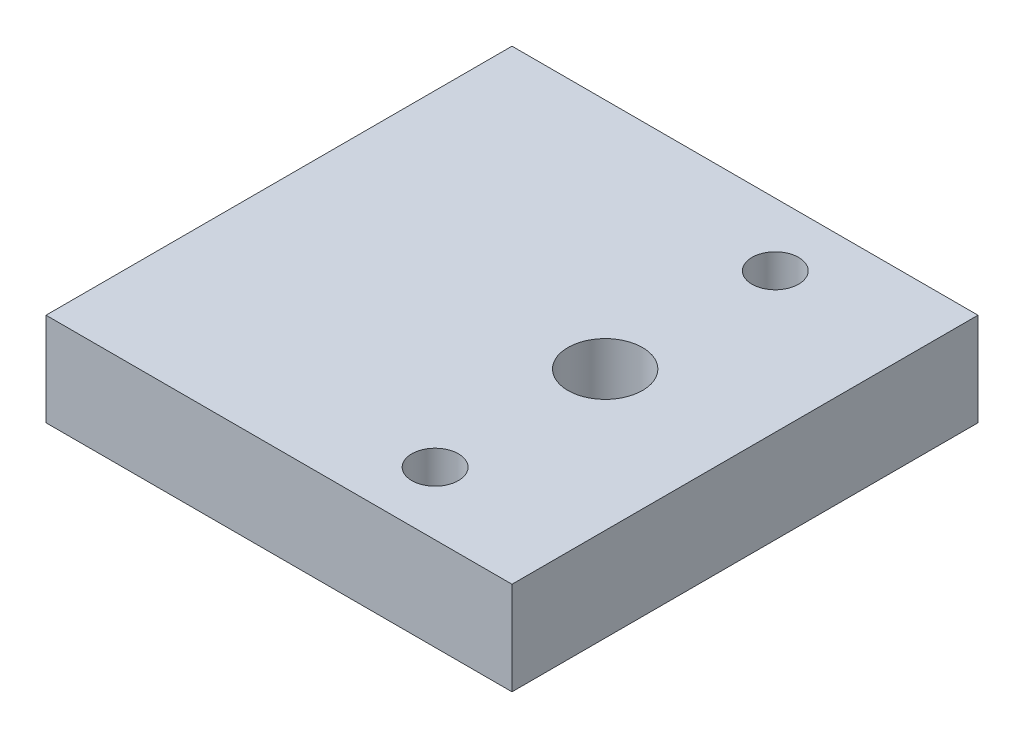
ISO-10303-21;
HEADER;
FILE_DESCRIPTION(('STEP AP214'),'2;1');
FILE_NAME('part.step','',(''),(''),'','','');
FILE_SCHEMA(('AUTOMOTIVE_DESIGN { 1 0 10303 214 1 1 1 1 }'));
ENDSEC;
DATA;
#1=APPLICATION_CONTEXT('core data for automotive mechanical design processes');
#2=APPLICATION_PROTOCOL_DEFINITION('international standard','automotive_design',2000,#1);
#3=PRODUCT_CONTEXT('',#1,'mechanical');
#4=PRODUCT('Part','Part','',(#3));
#5=PRODUCT_RELATED_PRODUCT_CATEGORY('part','',(#4));
#6=PRODUCT_DEFINITION_FORMATION('','',#4);
#7=PRODUCT_DEFINITION_CONTEXT('part definition',#1,'design');
#8=PRODUCT_DEFINITION('design','',#6,#7);
#9=PRODUCT_DEFINITION_SHAPE('','',#8);
#10=(LENGTH_UNIT() NAMED_UNIT(*) SI_UNIT(.MILLI.,.METRE.));
#11=(NAMED_UNIT(*) PLANE_ANGLE_UNIT() SI_UNIT($,.RADIAN.));
#12=(NAMED_UNIT(*) SI_UNIT($,.STERADIAN.) SOLID_ANGLE_UNIT());
#13=UNCERTAINTY_MEASURE_WITH_UNIT(LENGTH_MEASURE(1.E-05),#10,'distance_accuracy_value','');
#14=(GEOMETRIC_REPRESENTATION_CONTEXT(3) GLOBAL_UNCERTAINTY_ASSIGNED_CONTEXT((#13)) GLOBAL_UNIT_ASSIGNED_CONTEXT((#10,
#11,#12)) REPRESENTATION_CONTEXT('',''));
#15=CARTESIAN_POINT('',(0.,0.,0.));
#16=DIRECTION('',(0.,0.,1.));
#17=DIRECTION('',(1.,0.,0.));
#18=AXIS2_PLACEMENT_3D('',#15,#16,#17);
#19=CARTESIAN_POINT('',(25.,10.,25.));
#20=DIRECTION('',(-1.,0.,0.));
#21=DIRECTION('',(0.,0.,1.));
#22=AXIS2_PLACEMENT_3D('',#19,#20,#21);
#23=PLANE('',#22);
#24=DIRECTION('',(0.,0.,-1.));
#25=VECTOR('',#24,1.);
#26=CARTESIAN_POINT('',(25.,0.,25.));
#27=LINE('',#26,#25);
#28=CARTESIAN_POINT('',(25.,0.,25.));
#29=VERTEX_POINT('',#28);
#30=CARTESIAN_POINT('',(25.,0.,-25.));
#31=VERTEX_POINT('',#30);
#32=EDGE_CURVE('E98',#29,#31,#27,.T.);
#33=ORIENTED_EDGE('',*,*,#32,.T.);
#34=DIRECTION('',(0.,-1.,0.));
#35=VECTOR('',#34,1.);
#36=CARTESIAN_POINT('',(25.,10.,-25.));
#37=LINE('',#36,#35);
#38=CARTESIAN_POINT('',(25.,10.,-25.));
#39=VERTEX_POINT('',#38);
#40=EDGE_CURVE('E11',#39,#31,#37,.T.);
#41=ORIENTED_EDGE('',*,*,#40,.F.);
#42=DIRECTION('',(0.,0.,-1.));
#43=VECTOR('',#42,1.);
#44=CARTESIAN_POINT('',(25.,10.,25.));
#45=LINE('',#44,#43);
#46=CARTESIAN_POINT('',(25.,10.,25.));
#47=VERTEX_POINT('',#46);
#48=EDGE_CURVE('E86',#47,#39,#45,.T.);
#49=ORIENTED_EDGE('',*,*,#48,.F.);
#50=DIRECTION('',(0.,-1.,0.));
#51=VECTOR('',#50,1.);
#52=CARTESIAN_POINT('',(25.,10.,25.));
#53=LINE('',#52,#51);
#54=EDGE_CURVE('E94',#47,#29,#53,.T.);
#55=ORIENTED_EDGE('',*,*,#54,.T.);
#56=EDGE_LOOP('',(#33,#41,#49,#55));
#57=FACE_BOUND('',#56,.T.);
#58=ADVANCED_FACE('F35',(#57),#23,.F.);
#59=CARTESIAN_POINT('',(-25.,10.,-25.));
#60=DIRECTION('',(0.,0.,1.));
#61=DIRECTION('',(1.,0.,0.));
#62=AXIS2_PLACEMENT_3D('',#59,#60,#61);
#63=PLANE('',#62);
#64=DIRECTION('',(-1.,0.,0.));
#65=VECTOR('',#64,1.);
#66=CARTESIAN_POINT('',(-25.,0.,-25.));
#67=LINE('',#66,#65);
#68=CARTESIAN_POINT('',(-25.,0.,-25.));
#69=VERTEX_POINT('',#68);
#70=EDGE_CURVE('E90',#31,#69,#67,.T.);
#71=ORIENTED_EDGE('',*,*,#70,.T.);
#72=DIRECTION('',(0.,-1.,0.));
#73=VECTOR('',#72,1.);
#74=CARTESIAN_POINT('',(-25.,10.,-25.));
#75=LINE('',#74,#73);
#76=CARTESIAN_POINT('',(-25.,10.,-25.));
#77=VERTEX_POINT('',#76);
#78=EDGE_CURVE('E43',#77,#69,#75,.T.);
#79=ORIENTED_EDGE('',*,*,#78,.F.);
#80=DIRECTION('',(-1.,0.,0.));
#81=VECTOR('',#80,1.);
#82=CARTESIAN_POINT('',(-25.,10.,-25.));
#83=LINE('',#82,#81);
#84=EDGE_CURVE('E81',#39,#77,#83,.T.);
#85=ORIENTED_EDGE('',*,*,#84,.F.);
#86=ORIENTED_EDGE('',*,*,#40,.T.);
#87=EDGE_LOOP('',(#71,#79,#85,#86));
#88=FACE_BOUND('',#87,.T.);
#89=ADVANCED_FACE('F89',(#88),#63,.F.);
#90=CARTESIAN_POINT('',(-25.,10.,25.));
#91=DIRECTION('',(1.,0.,0.));
#92=DIRECTION('',(0.,0.,-1.));
#93=AXIS2_PLACEMENT_3D('',#90,#91,#92);
#94=PLANE('',#93);
#95=DIRECTION('',(0.,0.,1.));
#96=VECTOR('',#95,1.);
#97=CARTESIAN_POINT('',(-25.,0.,25.));
#98=LINE('',#97,#96);
#99=CARTESIAN_POINT('',(-25.,0.,25.));
#100=VERTEX_POINT('',#99);
#101=EDGE_CURVE('E68',#69,#100,#98,.T.);
#102=ORIENTED_EDGE('',*,*,#101,.T.);
#103=DIRECTION('',(0.,-1.,0.));
#104=VECTOR('',#103,1.);
#105=CARTESIAN_POINT('',(-25.,10.,25.));
#106=LINE('',#105,#104);
#107=CARTESIAN_POINT('',(-25.,10.,25.));
#108=VERTEX_POINT('',#107);
#109=EDGE_CURVE('E91',#108,#100,#106,.T.);
#110=ORIENTED_EDGE('',*,*,#109,.F.);
#111=DIRECTION('',(0.,0.,1.));
#112=VECTOR('',#111,1.);
#113=CARTESIAN_POINT('',(-25.,10.,25.));
#114=LINE('',#113,#112);
#115=EDGE_CURVE('E84',#77,#108,#114,.T.);
#116=ORIENTED_EDGE('',*,*,#115,.F.);
#117=ORIENTED_EDGE('',*,*,#78,.T.);
#118=EDGE_LOOP('',(#102,#110,#116,#117));
#119=FACE_BOUND('',#118,.T.);
#120=ADVANCED_FACE('F92',(#119),#94,.F.);
#121=CARTESIAN_POINT('',(-25.,10.,25.));
#122=DIRECTION('',(0.,0.,-1.));
#123=DIRECTION('',(-1.,0.,0.));
#124=AXIS2_PLACEMENT_3D('',#121,#122,#123);
#125=PLANE('',#124);
#126=DIRECTION('',(1.,0.,0.));
#127=VECTOR('',#126,1.);
#128=CARTESIAN_POINT('',(-25.,0.,25.));
#129=LINE('',#128,#127);
#130=EDGE_CURVE('E74',#100,#29,#129,.T.);
#131=ORIENTED_EDGE('',*,*,#130,.T.);
#132=ORIENTED_EDGE('',*,*,#54,.F.);
#133=DIRECTION('',(1.,0.,0.));
#134=VECTOR('',#133,1.);
#135=CARTESIAN_POINT('',(-25.,10.,25.));
#136=LINE('',#135,#134);
#137=EDGE_CURVE('E51',#108,#47,#136,.T.);
#138=ORIENTED_EDGE('',*,*,#137,.F.);
#139=ORIENTED_EDGE('',*,*,#109,.T.);
#140=EDGE_LOOP('',(#131,#132,#138,#139));
#141=FACE_BOUND('',#140,.T.);
#142=ADVANCED_FACE('F106',(#141),#125,.F.);
#143=CARTESIAN_POINT('',(0.,10.,0.));
#144=DIRECTION('',(0.,-1.,0.));
#145=DIRECTION('',(0.,0.,-1.));
#146=AXIS2_PLACEMENT_3D('',#143,#144,#145);
#147=PLANE('',#146);
#148=CARTESIAN_POINT('',(10.,10.,0.));
#149=DIRECTION('',(0.,1.,0.));
#150=DIRECTION('',(0.,0.,1.));
#151=AXIS2_PLACEMENT_3D('',#148,#149,#150);
#152=CIRCLE('',#151,4.);
#153=CARTESIAN_POINT('',(10.,10.,4.));
#154=VERTEX_POINT('',#153);
#155=EDGE_CURVE('E124',#154,#154,#152,.T.);
#156=ORIENTED_EDGE('',*,*,#155,.F.);
#157=EDGE_LOOP('',(#156));
#158=FACE_BOUND('',#157,.T.);
#159=CARTESIAN_POINT('',(10.,10.,18.25));
#160=DIRECTION('',(0.,1.,0.));
#161=DIRECTION('',(0.,0.,1.));
#162=AXIS2_PLACEMENT_3D('',#159,#160,#161);
#163=CIRCLE('',#162,2.5);
#164=CARTESIAN_POINT('',(10.,10.,20.75));
#165=VERTEX_POINT('',#164);
#166=EDGE_CURVE('E118',#165,#165,#163,.T.);
#167=ORIENTED_EDGE('',*,*,#166,.F.);
#168=EDGE_LOOP('',(#167));
#169=FACE_BOUND('',#168,.T.);
#170=CARTESIAN_POINT('',(10.,10.,-18.25));
#171=DIRECTION('',(0.,1.,0.));
#172=DIRECTION('',(0.,0.,1.));
#173=AXIS2_PLACEMENT_3D('',#170,#171,#172);
#174=CIRCLE('',#173,2.5);
#175=CARTESIAN_POINT('',(10.,10.,-15.75));
#176=VERTEX_POINT('',#175);
#177=EDGE_CURVE('E112',#176,#176,#174,.T.);
#178=ORIENTED_EDGE('',*,*,#177,.F.);
#179=EDGE_LOOP('',(#178));
#180=FACE_BOUND('',#179,.T.);
#181=ORIENTED_EDGE('',*,*,#48,.T.);
#182=ORIENTED_EDGE('',*,*,#84,.T.);
#183=ORIENTED_EDGE('',*,*,#115,.T.);
#184=ORIENTED_EDGE('',*,*,#137,.T.);
#185=EDGE_LOOP('',(#181,#182,#183,#184));
#186=FACE_BOUND('',#185,.T.);
#187=ADVANCED_FACE('F82',(#158,#169,#180,#186),#147,.F.);
#188=CARTESIAN_POINT('',(0.,0.,0.));
#189=DIRECTION('',(0.,-1.,0.));
#190=DIRECTION('',(0.,0.,-1.));
#191=AXIS2_PLACEMENT_3D('',#188,#189,#190);
#192=PLANE('',#191);
#193=CARTESIAN_POINT('',(10.,0.,0.));
#194=DIRECTION('',(0.,1.,0.));
#195=DIRECTION('',(0.,0.,1.));
#196=AXIS2_PLACEMENT_3D('',#193,#194,#195);
#197=CIRCLE('',#196,4.);
#198=CARTESIAN_POINT('',(10.,0.,4.));
#199=VERTEX_POINT('',#198);
#200=EDGE_CURVE('E121',#199,#199,#197,.T.);
#201=ORIENTED_EDGE('',*,*,#200,.T.);
#202=EDGE_LOOP('',(#201));
#203=FACE_BOUND('',#202,.T.);
#204=CARTESIAN_POINT('',(10.,0.,18.25));
#205=DIRECTION('',(0.,1.,0.));
#206=DIRECTION('',(0.,0.,1.));
#207=AXIS2_PLACEMENT_3D('',#204,#205,#206);
#208=CIRCLE('',#207,2.5);
#209=CARTESIAN_POINT('',(10.,0.,20.75));
#210=VERTEX_POINT('',#209);
#211=EDGE_CURVE('E115',#210,#210,#208,.T.);
#212=ORIENTED_EDGE('',*,*,#211,.T.);
#213=EDGE_LOOP('',(#212));
#214=FACE_BOUND('',#213,.T.);
#215=CARTESIAN_POINT('',(10.,0.,-18.25));
#216=DIRECTION('',(0.,1.,0.));
#217=DIRECTION('',(0.,0.,1.));
#218=AXIS2_PLACEMENT_3D('',#215,#216,#217);
#219=CIRCLE('',#218,2.5);
#220=CARTESIAN_POINT('',(10.,0.,-15.75));
#221=VERTEX_POINT('',#220);
#222=EDGE_CURVE('E101',#221,#221,#219,.T.);
#223=ORIENTED_EDGE('',*,*,#222,.T.);
#224=EDGE_LOOP('',(#223));
#225=FACE_BOUND('',#224,.T.);
#226=ORIENTED_EDGE('',*,*,#32,.F.);
#227=ORIENTED_EDGE('',*,*,#130,.F.);
#228=ORIENTED_EDGE('',*,*,#101,.F.);
#229=ORIENTED_EDGE('',*,*,#70,.F.);
#230=EDGE_LOOP('',(#226,#227,#228,#229));
#231=FACE_BOUND('',#230,.T.);
#232=ADVANCED_FACE('F109',(#203,#214,#225,#231),#192,.T.);
#233=CARTESIAN_POINT('',(10.,0.,-18.25));
#234=DIRECTION('',(0.,1.,0.));
#235=DIRECTION('',(0.,0.,1.));
#236=AXIS2_PLACEMENT_3D('',#233,#234,#235);
#237=CYLINDRICAL_SURFACE('',#236,2.5);
#238=ORIENTED_EDGE('',*,*,#222,.F.);
#239=EDGE_LOOP('',(#238));
#240=FACE_BOUND('',#239,.T.);
#241=ORIENTED_EDGE('',*,*,#177,.T.);
#242=EDGE_LOOP('',(#241));
#243=FACE_BOUND('',#242,.T.);
#244=ADVANCED_FACE('F146',(#240,#243),#237,.F.);
#245=CARTESIAN_POINT('',(10.,0.,18.25));
#246=DIRECTION('',(0.,1.,0.));
#247=DIRECTION('',(0.,0.,1.));
#248=AXIS2_PLACEMENT_3D('',#245,#246,#247);
#249=CYLINDRICAL_SURFACE('',#248,2.5);
#250=ORIENTED_EDGE('',*,*,#211,.F.);
#251=EDGE_LOOP('',(#250));
#252=FACE_BOUND('',#251,.T.);
#253=ORIENTED_EDGE('',*,*,#166,.T.);
#254=EDGE_LOOP('',(#253));
#255=FACE_BOUND('',#254,.T.);
#256=ADVANCED_FACE('F135',(#252,#255),#249,.F.);
#257=CARTESIAN_POINT('',(10.,0.,0.));
#258=DIRECTION('',(0.,1.,0.));
#259=DIRECTION('',(0.,0.,1.));
#260=AXIS2_PLACEMENT_3D('',#257,#258,#259);
#261=CYLINDRICAL_SURFACE('',#260,4.);
#262=ORIENTED_EDGE('',*,*,#200,.F.);
#263=EDGE_LOOP('',(#262));
#264=FACE_BOUND('',#263,.T.);
#265=ORIENTED_EDGE('',*,*,#155,.T.);
#266=EDGE_LOOP('',(#265));
#267=FACE_BOUND('',#266,.T.);
#268=ADVANCED_FACE('F132',(#264,#267),#261,.F.);
#269=CLOSED_SHELL('',(#58,#89,#120,#142,#187,#232,#244,#256,#268));
#270=MANIFOLD_SOLID_BREP('B2',#269);
#271=ADVANCED_BREP_SHAPE_REPRESENTATION('',(#18,#270),#14);
#272=SHAPE_DEFINITION_REPRESENTATION(#9,#271);
ENDSEC;
END-ISO-10303-21;
